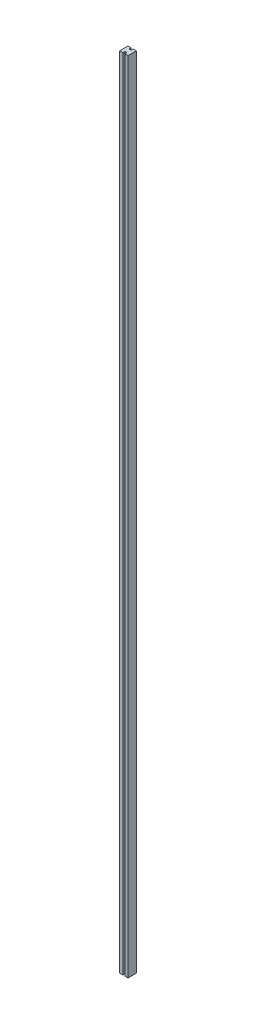
ISO-10303-21;
HEADER;
FILE_DESCRIPTION(('STEP AP214'),'2;1');
FILE_NAME('part.step','',(''),(''),'','','');
FILE_SCHEMA(('AUTOMOTIVE_DESIGN { 1 0 10303 214 1 1 1 1 }'));
ENDSEC;
DATA;
#1=APPLICATION_CONTEXT('core data for automotive mechanical design processes');
#2=APPLICATION_PROTOCOL_DEFINITION('international standard','automotive_design',2000,#1);
#3=PRODUCT_CONTEXT('',#1,'mechanical');
#4=PRODUCT('Part','Part','',(#3));
#5=PRODUCT_RELATED_PRODUCT_CATEGORY('part','',(#4));
#6=PRODUCT_DEFINITION_FORMATION('','',#4);
#7=PRODUCT_DEFINITION_CONTEXT('part definition',#1,'design');
#8=PRODUCT_DEFINITION('design','',#6,#7);
#9=PRODUCT_DEFINITION_SHAPE('','',#8);
#10=(LENGTH_UNIT() NAMED_UNIT(*) SI_UNIT(.MILLI.,.METRE.));
#11=(NAMED_UNIT(*) PLANE_ANGLE_UNIT() SI_UNIT($,.RADIAN.));
#12=(NAMED_UNIT(*) SI_UNIT($,.STERADIAN.) SOLID_ANGLE_UNIT());
#13=UNCERTAINTY_MEASURE_WITH_UNIT(LENGTH_MEASURE(1.E-05),#10,'distance_accuracy_value','');
#14=(GEOMETRIC_REPRESENTATION_CONTEXT(3) GLOBAL_UNCERTAINTY_ASSIGNED_CONTEXT((#13)) GLOBAL_UNIT_ASSIGNED_CONTEXT((#10,
#11,#12)) REPRESENTATION_CONTEXT('',''));
#15=CARTESIAN_POINT('',(0.,0.,0.));
#16=DIRECTION('',(0.,0.,1.));
#17=DIRECTION('',(1.,0.,0.));
#18=AXIS2_PLACEMENT_3D('',#15,#16,#17);
#19=CARTESIAN_POINT('',(0.,975.,20.3));
#20=DIRECTION('',(1.,0.,0.));
#21=DIRECTION('',(0.,0.,-1.));
#22=AXIS2_PLACEMENT_3D('',#19,#20,#21);
#23=PLANE('',#22);
#24=DIRECTION('',(0.,0.,1.));
#25=VECTOR('',#24,1.);
#26=CARTESIAN_POINT('',(0.,-975.,20.3));
#27=LINE('',#26,#25);
#28=CARTESIAN_POINT('',(0.,-975.,0.));
#29=VERTEX_POINT('',#28);
#30=CARTESIAN_POINT('',(0.,-975.,20.3));
#31=VERTEX_POINT('',#30);
#32=EDGE_CURVE('E155',#29,#31,#27,.T.);
#33=ORIENTED_EDGE('',*,*,#32,.T.);
#34=DIRECTION('',(0.,-1.,0.));
#35=VECTOR('',#34,1.);
#36=CARTESIAN_POINT('',(0.,975.,20.3));
#37=LINE('',#36,#35);
#38=CARTESIAN_POINT('',(0.,975.,20.3));
#39=VERTEX_POINT('',#38);
#40=EDGE_CURVE('E11',#39,#31,#37,.T.);
#41=ORIENTED_EDGE('',*,*,#40,.F.);
#42=DIRECTION('',(0.,0.,1.));
#43=VECTOR('',#42,1.);
#44=CARTESIAN_POINT('',(0.,975.,20.3));
#45=LINE('',#44,#43);
#46=CARTESIAN_POINT('',(0.,975.,0.));
#47=VERTEX_POINT('',#46);
#48=EDGE_CURVE('E177',#47,#39,#45,.T.);
#49=ORIENTED_EDGE('',*,*,#48,.F.);
#50=DIRECTION('',(0.,-1.,0.));
#51=VECTOR('',#50,1.);
#52=CARTESIAN_POINT('',(0.,975.,0.));
#53=LINE('',#52,#51);
#54=EDGE_CURVE('E151',#47,#29,#53,.T.);
#55=ORIENTED_EDGE('',*,*,#54,.T.);
#56=EDGE_LOOP('',(#33,#41,#49,#55));
#57=FACE_BOUND('',#56,.T.);
#58=ADVANCED_FACE('F35',(#57),#23,.F.);
#59=CARTESIAN_POINT('',(7.65,975.,20.3));
#60=DIRECTION('',(0.,0.,-1.));
#61=DIRECTION('',(-1.,0.,0.));
#62=AXIS2_PLACEMENT_3D('',#59,#60,#61);
#63=PLANE('',#62);
#64=DIRECTION('',(1.,0.,0.));
#65=VECTOR('',#64,1.);
#66=CARTESIAN_POINT('',(7.65,-975.,20.3));
#67=LINE('',#66,#65);
#68=CARTESIAN_POINT('',(7.65,-975.,20.3));
#69=VERTEX_POINT('',#68);
#70=EDGE_CURVE('E158',#31,#69,#67,.T.);
#71=ORIENTED_EDGE('',*,*,#70,.T.);
#72=DIRECTION('',(0.,-1.,0.));
#73=VECTOR('',#72,1.);
#74=CARTESIAN_POINT('',(7.65,975.,20.3));
#75=LINE('',#74,#73);
#76=CARTESIAN_POINT('',(7.65,975.,20.3));
#77=VERTEX_POINT('',#76);
#78=EDGE_CURVE('E43',#77,#69,#75,.T.);
#79=ORIENTED_EDGE('',*,*,#78,.F.);
#80=DIRECTION('',(1.,0.,0.));
#81=VECTOR('',#80,1.);
#82=CARTESIAN_POINT('',(7.65,975.,20.3));
#83=LINE('',#82,#81);
#84=EDGE_CURVE('E106',#39,#77,#83,.T.);
#85=ORIENTED_EDGE('',*,*,#84,.F.);
#86=ORIENTED_EDGE('',*,*,#40,.T.);
#87=EDGE_LOOP('',(#71,#79,#85,#86));
#88=FACE_BOUND('',#87,.T.);
#89=ADVANCED_FACE('F255',(#88),#63,.F.);
#90=CARTESIAN_POINT('',(7.65,975.,15.3));
#91=DIRECTION('',(-1.,0.,0.));
#92=DIRECTION('',(0.,0.,1.));
#93=AXIS2_PLACEMENT_3D('',#90,#91,#92);
#94=PLANE('',#93);
#95=DIRECTION('',(0.,0.,-1.));
#96=VECTOR('',#95,1.);
#97=CARTESIAN_POINT('',(7.65,-975.,15.3));
#98=LINE('',#97,#96);
#99=CARTESIAN_POINT('',(7.65,-975.,15.3));
#100=VERTEX_POINT('',#99);
#101=EDGE_CURVE('E160',#69,#100,#98,.T.);
#102=ORIENTED_EDGE('',*,*,#101,.T.);
#103=DIRECTION('',(0.,-1.,0.));
#104=VECTOR('',#103,1.);
#105=CARTESIAN_POINT('',(7.65,975.,15.3));
#106=LINE('',#105,#104);
#107=CARTESIAN_POINT('',(7.65,975.,15.3));
#108=VERTEX_POINT('',#107);
#109=EDGE_CURVE('E196',#108,#100,#106,.T.);
#110=ORIENTED_EDGE('',*,*,#109,.F.);
#111=DIRECTION('',(0.,0.,-1.));
#112=VECTOR('',#111,1.);
#113=CARTESIAN_POINT('',(7.65,975.,15.3));
#114=LINE('',#113,#112);
#115=EDGE_CURVE('E204',#77,#108,#114,.T.);
#116=ORIENTED_EDGE('',*,*,#115,.F.);
#117=ORIENTED_EDGE('',*,*,#78,.T.);
#118=EDGE_LOOP('',(#102,#110,#116,#117));
#119=FACE_BOUND('',#118,.T.);
#120=ADVANCED_FACE('F202',(#119),#94,.F.);
#121=CARTESIAN_POINT('',(12.65,975.,15.3));
#122=DIRECTION('',(0.,0.,-1.));
#123=DIRECTION('',(-1.,0.,0.));
#124=AXIS2_PLACEMENT_3D('',#121,#122,#123);
#125=PLANE('',#124);
#126=DIRECTION('',(1.,0.,0.));
#127=VECTOR('',#126,1.);
#128=CARTESIAN_POINT('',(12.65,-975.,15.3));
#129=LINE('',#128,#127);
#130=CARTESIAN_POINT('',(12.65,-975.,15.3));
#131=VERTEX_POINT('',#130);
#132=EDGE_CURVE('E162',#100,#131,#129,.T.);
#133=ORIENTED_EDGE('',*,*,#132,.T.);
#134=DIRECTION('',(0.,-1.,0.));
#135=VECTOR('',#134,1.);
#136=CARTESIAN_POINT('',(12.65,975.,15.3));
#137=LINE('',#136,#135);
#138=CARTESIAN_POINT('',(12.65,975.,15.3));
#139=VERTEX_POINT('',#138);
#140=EDGE_CURVE('E193',#139,#131,#137,.T.);
#141=ORIENTED_EDGE('',*,*,#140,.F.);
#142=DIRECTION('',(1.,0.,0.));
#143=VECTOR('',#142,1.);
#144=CARTESIAN_POINT('',(12.65,975.,15.3));
#145=LINE('',#144,#143);
#146=EDGE_CURVE('E222',#108,#139,#145,.T.);
#147=ORIENTED_EDGE('',*,*,#146,.F.);
#148=ORIENTED_EDGE('',*,*,#109,.T.);
#149=EDGE_LOOP('',(#133,#141,#147,#148));
#150=FACE_BOUND('',#149,.T.);
#151=ADVANCED_FACE('F213',(#150),#125,.F.);
#152=CARTESIAN_POINT('',(12.65,975.,20.3));
#153=DIRECTION('',(1.,0.,0.));
#154=DIRECTION('',(0.,0.,-1.));
#155=AXIS2_PLACEMENT_3D('',#152,#153,#154);
#156=PLANE('',#155);
#157=DIRECTION('',(0.,0.,1.));
#158=VECTOR('',#157,1.);
#159=CARTESIAN_POINT('',(12.65,-975.,20.3));
#160=LINE('',#159,#158);
#161=CARTESIAN_POINT('',(12.65,-975.,20.3));
#162=VERTEX_POINT('',#161);
#163=EDGE_CURVE('E164',#131,#162,#160,.T.);
#164=ORIENTED_EDGE('',*,*,#163,.T.);
#165=DIRECTION('',(0.,-1.,0.));
#166=VECTOR('',#165,1.);
#167=CARTESIAN_POINT('',(12.65,975.,20.3));
#168=LINE('',#167,#166);
#169=CARTESIAN_POINT('',(12.65,975.,20.3));
#170=VERTEX_POINT('',#169);
#171=EDGE_CURVE('E190',#170,#162,#168,.T.);
#172=ORIENTED_EDGE('',*,*,#171,.F.);
#173=DIRECTION('',(0.,0.,1.));
#174=VECTOR('',#173,1.);
#175=CARTESIAN_POINT('',(12.65,975.,20.3));
#176=LINE('',#175,#174);
#177=EDGE_CURVE('E219',#139,#170,#176,.T.);
#178=ORIENTED_EDGE('',*,*,#177,.F.);
#179=ORIENTED_EDGE('',*,*,#140,.T.);
#180=EDGE_LOOP('',(#164,#172,#178,#179));
#181=FACE_BOUND('',#180,.T.);
#182=ADVANCED_FACE('F217',(#181),#156,.F.);
#183=CARTESIAN_POINT('',(20.3,975.,20.3));
#184=DIRECTION('',(0.,0.,-1.));
#185=DIRECTION('',(-1.,0.,0.));
#186=AXIS2_PLACEMENT_3D('',#183,#184,#185);
#187=PLANE('',#186);
#188=DIRECTION('',(1.,0.,0.));
#189=VECTOR('',#188,1.);
#190=CARTESIAN_POINT('',(20.3,-975.,20.3));
#191=LINE('',#190,#189);
#192=CARTESIAN_POINT('',(20.3,-975.,20.3));
#193=VERTEX_POINT('',#192);
#194=EDGE_CURVE('E166',#162,#193,#191,.T.);
#195=ORIENTED_EDGE('',*,*,#194,.T.);
#196=DIRECTION('',(0.,-1.,0.));
#197=VECTOR('',#196,1.);
#198=CARTESIAN_POINT('',(20.3,975.,20.3));
#199=LINE('',#198,#197);
#200=CARTESIAN_POINT('',(20.3,975.,20.3));
#201=VERTEX_POINT('',#200);
#202=EDGE_CURVE('E187',#201,#193,#199,.T.);
#203=ORIENTED_EDGE('',*,*,#202,.F.);
#204=DIRECTION('',(1.,0.,0.));
#205=VECTOR('',#204,1.);
#206=CARTESIAN_POINT('',(20.3,975.,20.3));
#207=LINE('',#206,#205);
#208=EDGE_CURVE('E221',#170,#201,#207,.T.);
#209=ORIENTED_EDGE('',*,*,#208,.F.);
#210=ORIENTED_EDGE('',*,*,#171,.T.);
#211=EDGE_LOOP('',(#195,#203,#209,#210));
#212=FACE_BOUND('',#211,.T.);
#213=ADVANCED_FACE('F268',(#212),#187,.F.);
#214=CARTESIAN_POINT('',(20.3,975.,0.));
#215=DIRECTION('',(-1.,0.,0.));
#216=DIRECTION('',(0.,0.,1.));
#217=AXIS2_PLACEMENT_3D('',#214,#215,#216);
#218=PLANE('',#217);
#219=DIRECTION('',(0.,0.,-1.));
#220=VECTOR('',#219,1.);
#221=CARTESIAN_POINT('',(20.3,-975.,0.));
#222=LINE('',#221,#220);
#223=CARTESIAN_POINT('',(20.3,-975.,0.));
#224=VERTEX_POINT('',#223);
#225=EDGE_CURVE('E168',#193,#224,#222,.T.);
#226=ORIENTED_EDGE('',*,*,#225,.T.);
#227=DIRECTION('',(0.,-1.,0.));
#228=VECTOR('',#227,1.);
#229=CARTESIAN_POINT('',(20.3,975.,0.));
#230=LINE('',#229,#228);
#231=CARTESIAN_POINT('',(20.3,975.,0.));
#232=VERTEX_POINT('',#231);
#233=EDGE_CURVE('E184',#232,#224,#230,.T.);
#234=ORIENTED_EDGE('',*,*,#233,.F.);
#235=DIRECTION('',(0.,0.,-1.));
#236=VECTOR('',#235,1.);
#237=CARTESIAN_POINT('',(20.3,975.,0.));
#238=LINE('',#237,#236);
#239=EDGE_CURVE('E224',#201,#232,#238,.T.);
#240=ORIENTED_EDGE('',*,*,#239,.F.);
#241=ORIENTED_EDGE('',*,*,#202,.T.);
#242=EDGE_LOOP('',(#226,#234,#240,#241));
#243=FACE_BOUND('',#242,.T.);
#244=ADVANCED_FACE('F271',(#243),#218,.F.);
#245=CARTESIAN_POINT('',(12.65,975.,0.));
#246=DIRECTION('',(0.,0.,1.));
#247=DIRECTION('',(1.,0.,0.));
#248=AXIS2_PLACEMENT_3D('',#245,#246,#247);
#249=PLANE('',#248);
#250=DIRECTION('',(-1.,0.,0.));
#251=VECTOR('',#250,1.);
#252=CARTESIAN_POINT('',(12.65,-975.,0.));
#253=LINE('',#252,#251);
#254=CARTESIAN_POINT('',(12.65,-975.,0.));
#255=VERTEX_POINT('',#254);
#256=EDGE_CURVE('E170',#224,#255,#253,.T.);
#257=ORIENTED_EDGE('',*,*,#256,.T.);
#258=DIRECTION('',(0.,-1.,0.));
#259=VECTOR('',#258,1.);
#260=CARTESIAN_POINT('',(12.65,975.,0.));
#261=LINE('',#260,#259);
#262=CARTESIAN_POINT('',(12.65,975.,0.));
#263=VERTEX_POINT('',#262);
#264=EDGE_CURVE('E181',#263,#255,#261,.T.);
#265=ORIENTED_EDGE('',*,*,#264,.F.);
#266=DIRECTION('',(-1.,0.,0.));
#267=VECTOR('',#266,1.);
#268=CARTESIAN_POINT('',(12.65,975.,0.));
#269=LINE('',#268,#267);
#270=EDGE_CURVE('E230',#232,#263,#269,.T.);
#271=ORIENTED_EDGE('',*,*,#270,.F.);
#272=ORIENTED_EDGE('',*,*,#233,.T.);
#273=EDGE_LOOP('',(#257,#265,#271,#272));
#274=FACE_BOUND('',#273,.T.);
#275=ADVANCED_FACE('F236',(#274),#249,.F.);
#276=CARTESIAN_POINT('',(12.65,975.,5.));
#277=DIRECTION('',(1.,0.,0.));
#278=DIRECTION('',(0.,0.,-1.));
#279=AXIS2_PLACEMENT_3D('',#276,#277,#278);
#280=PLANE('',#279);
#281=DIRECTION('',(0.,0.,1.));
#282=VECTOR('',#281,1.);
#283=CARTESIAN_POINT('',(12.65,-975.,5.));
#284=LINE('',#283,#282);
#285=CARTESIAN_POINT('',(12.65,-975.,5.));
#286=VERTEX_POINT('',#285);
#287=EDGE_CURVE('E172',#255,#286,#284,.T.);
#288=ORIENTED_EDGE('',*,*,#287,.T.);
#289=DIRECTION('',(0.,-1.,0.));
#290=VECTOR('',#289,1.);
#291=CARTESIAN_POINT('',(12.65,975.,5.));
#292=LINE('',#291,#290);
#293=CARTESIAN_POINT('',(12.65,975.,5.));
#294=VERTEX_POINT('',#293);
#295=EDGE_CURVE('E146',#294,#286,#292,.T.);
#296=ORIENTED_EDGE('',*,*,#295,.F.);
#297=DIRECTION('',(0.,0.,1.));
#298=VECTOR('',#297,1.);
#299=CARTESIAN_POINT('',(12.65,975.,5.));
#300=LINE('',#299,#298);
#301=EDGE_CURVE('E137',#263,#294,#300,.T.);
#302=ORIENTED_EDGE('',*,*,#301,.F.);
#303=ORIENTED_EDGE('',*,*,#264,.T.);
#304=EDGE_LOOP('',(#288,#296,#302,#303));
#305=FACE_BOUND('',#304,.T.);
#306=ADVANCED_FACE('F240',(#305),#280,.F.);
#307=CARTESIAN_POINT('',(7.65,975.,5.));
#308=DIRECTION('',(0.,0.,1.));
#309=DIRECTION('',(1.,0.,0.));
#310=AXIS2_PLACEMENT_3D('',#307,#308,#309);
#311=PLANE('',#310);
#312=DIRECTION('',(-1.,0.,0.));
#313=VECTOR('',#312,1.);
#314=CARTESIAN_POINT('',(7.65,-975.,5.));
#315=LINE('',#314,#313);
#316=CARTESIAN_POINT('',(7.65,-975.,5.));
#317=VERTEX_POINT('',#316);
#318=EDGE_CURVE('E145',#286,#317,#315,.T.);
#319=ORIENTED_EDGE('',*,*,#318,.T.);
#320=DIRECTION('',(0.,-1.,0.));
#321=VECTOR('',#320,1.);
#322=CARTESIAN_POINT('',(7.65,975.,5.));
#323=LINE('',#322,#321);
#324=CARTESIAN_POINT('',(7.65,975.,5.));
#325=VERTEX_POINT('',#324);
#326=EDGE_CURVE('E142',#325,#317,#323,.T.);
#327=ORIENTED_EDGE('',*,*,#326,.F.);
#328=DIRECTION('',(-1.,0.,0.));
#329=VECTOR('',#328,1.);
#330=CARTESIAN_POINT('',(7.65,975.,5.));
#331=LINE('',#330,#329);
#332=EDGE_CURVE('E131',#294,#325,#331,.T.);
#333=ORIENTED_EDGE('',*,*,#332,.F.);
#334=ORIENTED_EDGE('',*,*,#295,.T.);
#335=EDGE_LOOP('',(#319,#327,#333,#334));
#336=FACE_BOUND('',#335,.T.);
#337=ADVANCED_FACE('F143',(#336),#311,.F.);
#338=CARTESIAN_POINT('',(7.65,975.,0.));
#339=DIRECTION('',(-1.,0.,0.));
#340=DIRECTION('',(0.,0.,1.));
#341=AXIS2_PLACEMENT_3D('',#338,#339,#340);
#342=PLANE('',#341);
#343=DIRECTION('',(0.,0.,-1.));
#344=VECTOR('',#343,1.);
#345=CARTESIAN_POINT('',(7.65,-975.,0.));
#346=LINE('',#345,#344);
#347=CARTESIAN_POINT('',(7.65,-975.,0.));
#348=VERTEX_POINT('',#347);
#349=EDGE_CURVE('E92',#317,#348,#346,.T.);
#350=ORIENTED_EDGE('',*,*,#349,.T.);
#351=DIRECTION('',(0.,-1.,0.));
#352=VECTOR('',#351,1.);
#353=CARTESIAN_POINT('',(7.65,975.,0.));
#354=LINE('',#353,#352);
#355=CARTESIAN_POINT('',(7.65,975.,0.));
#356=VERTEX_POINT('',#355);
#357=EDGE_CURVE('E147',#356,#348,#354,.T.);
#358=ORIENTED_EDGE('',*,*,#357,.F.);
#359=DIRECTION('',(0.,0.,-1.));
#360=VECTOR('',#359,1.);
#361=CARTESIAN_POINT('',(7.65,975.,0.));
#362=LINE('',#361,#360);
#363=EDGE_CURVE('E135',#325,#356,#362,.T.);
#364=ORIENTED_EDGE('',*,*,#363,.F.);
#365=ORIENTED_EDGE('',*,*,#326,.T.);
#366=EDGE_LOOP('',(#350,#358,#364,#365));
#367=FACE_BOUND('',#366,.T.);
#368=ADVANCED_FACE('F149',(#367),#342,.F.);
#369=CARTESIAN_POINT('',(0.,975.,0.));
#370=DIRECTION('',(0.,0.,1.));
#371=DIRECTION('',(1.,0.,0.));
#372=AXIS2_PLACEMENT_3D('',#369,#370,#371);
#373=PLANE('',#372);
#374=DIRECTION('',(-1.,0.,0.));
#375=VECTOR('',#374,1.);
#376=CARTESIAN_POINT('',(0.,-975.,0.));
#377=LINE('',#376,#375);
#378=EDGE_CURVE('E98',#348,#29,#377,.T.);
#379=ORIENTED_EDGE('',*,*,#378,.T.);
#380=ORIENTED_EDGE('',*,*,#54,.F.);
#381=DIRECTION('',(-1.,0.,0.));
#382=VECTOR('',#381,1.);
#383=CARTESIAN_POINT('',(0.,975.,0.));
#384=LINE('',#383,#382);
#385=EDGE_CURVE('E51',#356,#47,#384,.T.);
#386=ORIENTED_EDGE('',*,*,#385,.F.);
#387=ORIENTED_EDGE('',*,*,#357,.T.);
#388=EDGE_LOOP('',(#379,#380,#386,#387));
#389=FACE_BOUND('',#388,.T.);
#390=ADVANCED_FACE('F244',(#389),#373,.F.);
#391=CARTESIAN_POINT('',(0.,975.,0.));
#392=DIRECTION('',(0.,-1.,0.));
#393=DIRECTION('',(0.,0.,-1.));
#394=AXIS2_PLACEMENT_3D('',#391,#392,#393);
#395=PLANE('',#394);
#396=ORIENTED_EDGE('',*,*,#48,.T.);
#397=ORIENTED_EDGE('',*,*,#84,.T.);
#398=ORIENTED_EDGE('',*,*,#115,.T.);
#399=ORIENTED_EDGE('',*,*,#146,.T.);
#400=ORIENTED_EDGE('',*,*,#177,.T.);
#401=ORIENTED_EDGE('',*,*,#208,.T.);
#402=ORIENTED_EDGE('',*,*,#239,.T.);
#403=ORIENTED_EDGE('',*,*,#270,.T.);
#404=ORIENTED_EDGE('',*,*,#301,.T.);
#405=ORIENTED_EDGE('',*,*,#332,.T.);
#406=ORIENTED_EDGE('',*,*,#363,.T.);
#407=ORIENTED_EDGE('',*,*,#385,.T.);
#408=EDGE_LOOP('',(#396,#397,#398,#399,#400,#401,#402,#403,#404,#405,#406,#407));
#409=FACE_BOUND('',#408,.T.);
#410=ADVANCED_FACE('F133',(#409),#395,.F.);
#411=CARTESIAN_POINT('',(0.,-975.,0.));
#412=DIRECTION('',(0.,-1.,0.));
#413=DIRECTION('',(0.,0.,-1.));
#414=AXIS2_PLACEMENT_3D('',#411,#412,#413);
#415=PLANE('',#414);
#416=ORIENTED_EDGE('',*,*,#32,.F.);
#417=ORIENTED_EDGE('',*,*,#378,.F.);
#418=ORIENTED_EDGE('',*,*,#349,.F.);
#419=ORIENTED_EDGE('',*,*,#318,.F.);
#420=ORIENTED_EDGE('',*,*,#287,.F.);
#421=ORIENTED_EDGE('',*,*,#256,.F.);
#422=ORIENTED_EDGE('',*,*,#225,.F.);
#423=ORIENTED_EDGE('',*,*,#194,.F.);
#424=ORIENTED_EDGE('',*,*,#163,.F.);
#425=ORIENTED_EDGE('',*,*,#132,.F.);
#426=ORIENTED_EDGE('',*,*,#101,.F.);
#427=ORIENTED_EDGE('',*,*,#70,.F.);
#428=EDGE_LOOP('',(#416,#417,#418,#419,#420,#421,#422,#423,#424,#425,#426,#427));
#429=FACE_BOUND('',#428,.T.);
#430=ADVANCED_FACE('F208',(#429),#415,.T.);
#431=CLOSED_SHELL('',(#58,#89,#120,#151,#182,#213,#244,#275,#306,#337,#368,#390,#410,#430));
#432=MANIFOLD_SOLID_BREP('B2',#431);
#433=ADVANCED_BREP_SHAPE_REPRESENTATION('',(#18,#432),#14);
#434=SHAPE_DEFINITION_REPRESENTATION(#9,#433);
ENDSEC;
END-ISO-10303-21;
